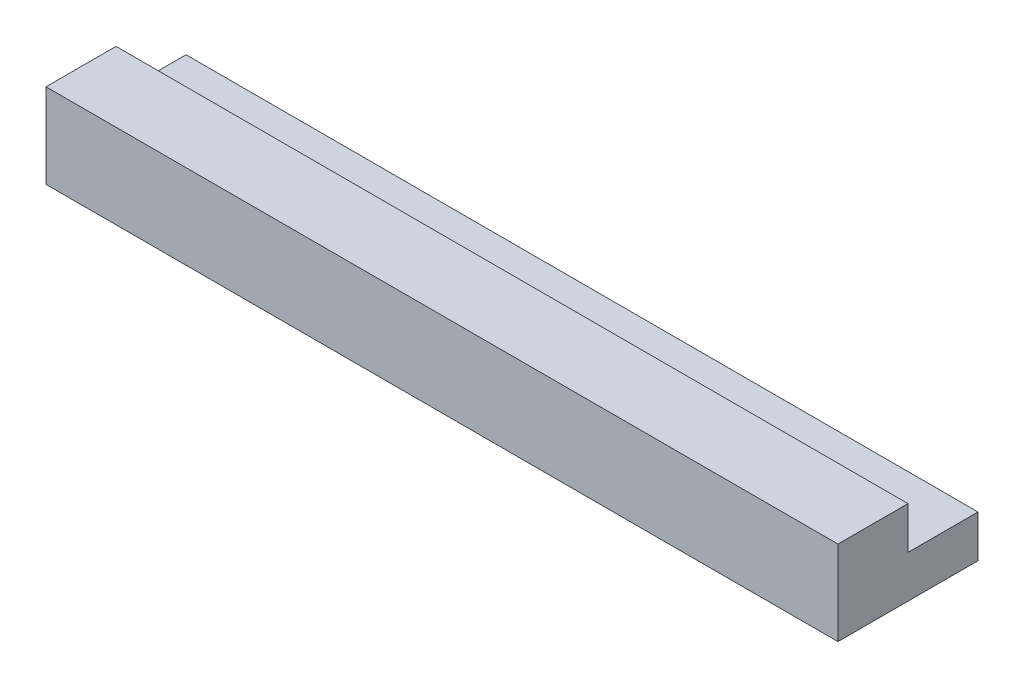
ISO-10303-21;
HEADER;
FILE_DESCRIPTION(('STEP AP214'),'2;1');
FILE_NAME('part.step','',(''),(''),'','','');
FILE_SCHEMA(('AUTOMOTIVE_DESIGN { 1 0 10303 214 1 1 1 1 }'));
ENDSEC;
DATA;
#1=APPLICATION_CONTEXT('core data for automotive mechanical design processes');
#2=APPLICATION_PROTOCOL_DEFINITION('international standard','automotive_design',2000,#1);
#3=PRODUCT_CONTEXT('',#1,'mechanical');
#4=PRODUCT('Part','Part','',(#3));
#5=PRODUCT_RELATED_PRODUCT_CATEGORY('part','',(#4));
#6=PRODUCT_DEFINITION_FORMATION('','',#4);
#7=PRODUCT_DEFINITION_CONTEXT('part definition',#1,'design');
#8=PRODUCT_DEFINITION('design','',#6,#7);
#9=PRODUCT_DEFINITION_SHAPE('','',#8);
#10=(LENGTH_UNIT() NAMED_UNIT(*) SI_UNIT(.MILLI.,.METRE.));
#11=(NAMED_UNIT(*) PLANE_ANGLE_UNIT() SI_UNIT($,.RADIAN.));
#12=(NAMED_UNIT(*) SI_UNIT($,.STERADIAN.) SOLID_ANGLE_UNIT());
#13=UNCERTAINTY_MEASURE_WITH_UNIT(LENGTH_MEASURE(1.E-05),#10,'distance_accuracy_value','');
#14=(GEOMETRIC_REPRESENTATION_CONTEXT(3) GLOBAL_UNCERTAINTY_ASSIGNED_CONTEXT((#13)) GLOBAL_UNIT_ASSIGNED_CONTEXT((#10,
#11,#12)) REPRESENTATION_CONTEXT('',''));
#15=CARTESIAN_POINT('',(0.,0.,0.));
#16=DIRECTION('',(0.,0.,1.));
#17=DIRECTION('',(1.,0.,0.));
#18=AXIS2_PLACEMENT_3D('',#15,#16,#17);
#19=CARTESIAN_POINT('',(16.4,1.75,-2.9));
#20=DIRECTION('',(-1.,0.,0.));
#21=DIRECTION('',(0.,0.,1.));
#22=AXIS2_PLACEMENT_3D('',#19,#20,#21);
#23=PLANE('',#22);
#24=DIRECTION('',(0.,0.,-1.));
#25=VECTOR('',#24,1.);
#26=CARTESIAN_POINT('',(16.4,0.,-2.9));
#27=LINE('',#26,#25);
#28=CARTESIAN_POINT('',(16.4,0.,2.9));
#29=VERTEX_POINT('',#28);
#30=CARTESIAN_POINT('',(16.4,0.,-2.9));
#31=VERTEX_POINT('',#30);
#32=EDGE_CURVE('E100',#29,#31,#27,.T.);
#33=ORIENTED_EDGE('',*,*,#32,.T.);
#34=DIRECTION('',(0.,-1.,0.));
#35=VECTOR('',#34,1.);
#36=CARTESIAN_POINT('',(16.4,1.75,-2.9));
#37=LINE('',#36,#35);
#38=CARTESIAN_POINT('',(16.4,1.75,-2.9));
#39=VERTEX_POINT('',#38);
#40=EDGE_CURVE('E11',#39,#31,#37,.T.);
#41=ORIENTED_EDGE('',*,*,#40,.F.);
#42=DIRECTION('',(0.,0.,-1.));
#43=VECTOR('',#42,1.);
#44=CARTESIAN_POINT('',(16.4,1.75,-2.9));
#45=LINE('',#44,#43);
#46=CARTESIAN_POINT('',(16.4,1.75,0.));
#47=VERTEX_POINT('',#46);
#48=EDGE_CURVE('E93',#47,#39,#45,.T.);
#49=ORIENTED_EDGE('',*,*,#48,.F.);
#50=DIRECTION('',(0.,-1.,0.));
#51=VECTOR('',#50,1.);
#52=CARTESIAN_POINT('',(16.4,3.5,0.));
#53=LINE('',#52,#51);
#54=CARTESIAN_POINT('',(16.4,3.5,0.));
#55=VERTEX_POINT('',#54);
#56=EDGE_CURVE('E108',#55,#47,#53,.T.);
#57=ORIENTED_EDGE('',*,*,#56,.F.);
#58=DIRECTION('',(0.,0.,-1.));
#59=VECTOR('',#58,1.);
#60=CARTESIAN_POINT('',(16.4,3.5,2.9));
#61=LINE('',#60,#59);
#62=CARTESIAN_POINT('',(16.4,3.5,2.9));
#63=VERTEX_POINT('',#62);
#64=EDGE_CURVE('E103',#63,#55,#61,.T.);
#65=ORIENTED_EDGE('',*,*,#64,.F.);
#66=DIRECTION('',(0.,-1.,0.));
#67=VECTOR('',#66,1.);
#68=CARTESIAN_POINT('',(16.4,1.75,2.9));
#69=LINE('',#68,#67);
#70=EDGE_CURVE('E86',#63,#29,#69,.T.);
#71=ORIENTED_EDGE('',*,*,#70,.T.);
#72=EDGE_LOOP('',(#33,#41,#49,#57,#65,#71));
#73=FACE_BOUND('',#72,.T.);
#74=ADVANCED_FACE('F41',(#73),#23,.F.);
#75=CARTESIAN_POINT('',(-16.4,1.75,-2.9));
#76=DIRECTION('',(0.,0.,1.));
#77=DIRECTION('',(1.,0.,0.));
#78=AXIS2_PLACEMENT_3D('',#75,#76,#77);
#79=PLANE('',#78);
#80=DIRECTION('',(-1.,0.,0.));
#81=VECTOR('',#80,1.);
#82=CARTESIAN_POINT('',(-16.4,0.,-2.9));
#83=LINE('',#82,#81);
#84=CARTESIAN_POINT('',(-16.4,0.,-2.9));
#85=VERTEX_POINT('',#84);
#86=EDGE_CURVE('E107',#31,#85,#83,.T.);
#87=ORIENTED_EDGE('',*,*,#86,.T.);
#88=DIRECTION('',(0.,-1.,0.));
#89=VECTOR('',#88,1.);
#90=CARTESIAN_POINT('',(-16.4,1.75,-2.9));
#91=LINE('',#90,#89);
#92=CARTESIAN_POINT('',(-16.4,1.75,-2.9));
#93=VERTEX_POINT('',#92);
#94=EDGE_CURVE('E48',#93,#85,#91,.T.);
#95=ORIENTED_EDGE('',*,*,#94,.F.);
#96=DIRECTION('',(-1.,0.,0.));
#97=VECTOR('',#96,1.);
#98=CARTESIAN_POINT('',(-16.4,1.75,-2.9));
#99=LINE('',#98,#97);
#100=EDGE_CURVE('E61',#39,#93,#99,.T.);
#101=ORIENTED_EDGE('',*,*,#100,.F.);
#102=ORIENTED_EDGE('',*,*,#40,.T.);
#103=EDGE_LOOP('',(#87,#95,#101,#102));
#104=FACE_BOUND('',#103,.T.);
#105=ADVANCED_FACE('F124',(#104),#79,.F.);
#106=CARTESIAN_POINT('',(-16.4,1.75,-2.9));
#107=DIRECTION('',(1.,0.,0.));
#108=DIRECTION('',(0.,0.,-1.));
#109=AXIS2_PLACEMENT_3D('',#106,#107,#108);
#110=PLANE('',#109);
#111=DIRECTION('',(0.,0.,1.));
#112=VECTOR('',#111,1.);
#113=CARTESIAN_POINT('',(-16.4,0.,-2.9));
#114=LINE('',#113,#112);
#115=CARTESIAN_POINT('',(-16.4,0.,2.9));
#116=VERTEX_POINT('',#115);
#117=EDGE_CURVE('E94',#85,#116,#114,.T.);
#118=ORIENTED_EDGE('',*,*,#117,.T.);
#119=DIRECTION('',(0.,-1.,0.));
#120=VECTOR('',#119,1.);
#121=CARTESIAN_POINT('',(-16.4,1.75,2.9));
#122=LINE('',#121,#120);
#123=CARTESIAN_POINT('',(-16.4,3.5,2.9));
#124=VERTEX_POINT('',#123);
#125=EDGE_CURVE('E89',#124,#116,#122,.T.);
#126=ORIENTED_EDGE('',*,*,#125,.F.);
#127=DIRECTION('',(0.,0.,1.));
#128=VECTOR('',#127,1.);
#129=CARTESIAN_POINT('',(-16.4,3.5,2.9));
#130=LINE('',#129,#128);
#131=CARTESIAN_POINT('',(-16.4,3.5,0.));
#132=VERTEX_POINT('',#131);
#133=EDGE_CURVE('E144',#132,#124,#130,.T.);
#134=ORIENTED_EDGE('',*,*,#133,.F.);
#135=DIRECTION('',(0.,-1.,0.));
#136=VECTOR('',#135,1.);
#137=CARTESIAN_POINT('',(-16.4,3.5,0.));
#138=LINE('',#137,#136);
#139=CARTESIAN_POINT('',(-16.4,1.75,0.));
#140=VERTEX_POINT('',#139);
#141=EDGE_CURVE('E112',#132,#140,#138,.T.);
#142=ORIENTED_EDGE('',*,*,#141,.T.);
#143=DIRECTION('',(0.,0.,1.));
#144=VECTOR('',#143,1.);
#145=CARTESIAN_POINT('',(-16.4,1.75,-2.9));
#146=LINE('',#145,#144);
#147=EDGE_CURVE('E104',#93,#140,#146,.T.);
#148=ORIENTED_EDGE('',*,*,#147,.F.);
#149=ORIENTED_EDGE('',*,*,#94,.T.);
#150=EDGE_LOOP('',(#118,#126,#134,#142,#148,#149));
#151=FACE_BOUND('',#150,.T.);
#152=ADVANCED_FACE('F121',(#151),#110,.F.);
#153=CARTESIAN_POINT('',(-16.4,1.75,2.9));
#154=DIRECTION('',(0.,0.,-1.));
#155=DIRECTION('',(-1.,0.,0.));
#156=AXIS2_PLACEMENT_3D('',#153,#154,#155);
#157=PLANE('',#156);
#158=DIRECTION('',(1.,0.,0.));
#159=VECTOR('',#158,1.);
#160=CARTESIAN_POINT('',(-16.4,0.,2.9));
#161=LINE('',#160,#159);
#162=EDGE_CURVE('E81',#116,#29,#161,.T.);
#163=ORIENTED_EDGE('',*,*,#162,.T.);
#164=ORIENTED_EDGE('',*,*,#70,.F.);
#165=DIRECTION('',(1.,0.,0.));
#166=VECTOR('',#165,1.);
#167=CARTESIAN_POINT('',(-16.4,3.5,2.9));
#168=LINE('',#167,#166);
#169=EDGE_CURVE('E140',#124,#63,#168,.T.);
#170=ORIENTED_EDGE('',*,*,#169,.F.);
#171=ORIENTED_EDGE('',*,*,#125,.T.);
#172=EDGE_LOOP('',(#163,#164,#170,#171));
#173=FACE_BOUND('',#172,.T.);
#174=ADVANCED_FACE('F83',(#173),#157,.F.);
#175=CARTESIAN_POINT('',(0.,1.75,0.));
#176=DIRECTION('',(0.,1.,0.));
#177=DIRECTION('',(0.,0.,1.));
#178=AXIS2_PLACEMENT_3D('',#175,#176,#177);
#179=PLANE('',#178);
#180=DIRECTION('',(-1.,0.,0.));
#181=VECTOR('',#180,1.);
#182=CARTESIAN_POINT('',(-16.4,1.75,0.));
#183=LINE('',#182,#181);
#184=EDGE_CURVE('E55',#47,#140,#183,.T.);
#185=ORIENTED_EDGE('',*,*,#184,.F.);
#186=ORIENTED_EDGE('',*,*,#48,.T.);
#187=ORIENTED_EDGE('',*,*,#100,.T.);
#188=ORIENTED_EDGE('',*,*,#147,.T.);
#189=EDGE_LOOP('',(#185,#186,#187,#188));
#190=FACE_BOUND('',#189,.T.);
#191=ADVANCED_FACE('F145',(#190),#179,.T.);
#192=CARTESIAN_POINT('',(0.,0.,0.));
#193=DIRECTION('',(0.,1.,0.));
#194=DIRECTION('',(0.,0.,1.));
#195=AXIS2_PLACEMENT_3D('',#192,#193,#194);
#196=PLANE('',#195);
#197=ORIENTED_EDGE('',*,*,#32,.F.);
#198=ORIENTED_EDGE('',*,*,#162,.F.);
#199=ORIENTED_EDGE('',*,*,#117,.F.);
#200=ORIENTED_EDGE('',*,*,#86,.F.);
#201=EDGE_LOOP('',(#197,#198,#199,#200));
#202=FACE_BOUND('',#201,.T.);
#203=ADVANCED_FACE('F106',(#202),#196,.F.);
#204=CARTESIAN_POINT('',(-16.4,3.5,0.));
#205=DIRECTION('',(0.,0.,1.));
#206=DIRECTION('',(1.,0.,0.));
#207=AXIS2_PLACEMENT_3D('',#204,#205,#206);
#208=PLANE('',#207);
#209=ORIENTED_EDGE('',*,*,#184,.T.);
#210=ORIENTED_EDGE('',*,*,#141,.F.);
#211=DIRECTION('',(-1.,0.,0.));
#212=VECTOR('',#211,1.);
#213=CARTESIAN_POINT('',(-16.4,3.5,0.));
#214=LINE('',#213,#212);
#215=EDGE_CURVE('E133',#55,#132,#214,.T.);
#216=ORIENTED_EDGE('',*,*,#215,.F.);
#217=ORIENTED_EDGE('',*,*,#56,.T.);
#218=EDGE_LOOP('',(#209,#210,#216,#217));
#219=FACE_BOUND('',#218,.T.);
#220=ADVANCED_FACE('F129',(#219),#208,.F.);
#221=CARTESIAN_POINT('',(0.,3.5,0.));
#222=DIRECTION('',(0.,-1.,0.));
#223=DIRECTION('',(0.,0.,-1.));
#224=AXIS2_PLACEMENT_3D('',#221,#222,#223);
#225=PLANE('',#224);
#226=ORIENTED_EDGE('',*,*,#133,.T.);
#227=ORIENTED_EDGE('',*,*,#169,.T.);
#228=ORIENTED_EDGE('',*,*,#64,.T.);
#229=ORIENTED_EDGE('',*,*,#215,.T.);
#230=EDGE_LOOP('',(#226,#227,#228,#229));
#231=FACE_BOUND('',#230,.T.);
#232=ADVANCED_FACE('F150',(#231),#225,.F.);
#233=CLOSED_SHELL('',(#74,#105,#152,#174,#191,#203,#220,#232));
#234=MANIFOLD_SOLID_BREP('B2',#233);
#235=ADVANCED_BREP_SHAPE_REPRESENTATION('',(#18,#234),#14);
#236=SHAPE_DEFINITION_REPRESENTATION(#9,#235);
ENDSEC;
END-ISO-10303-21;
